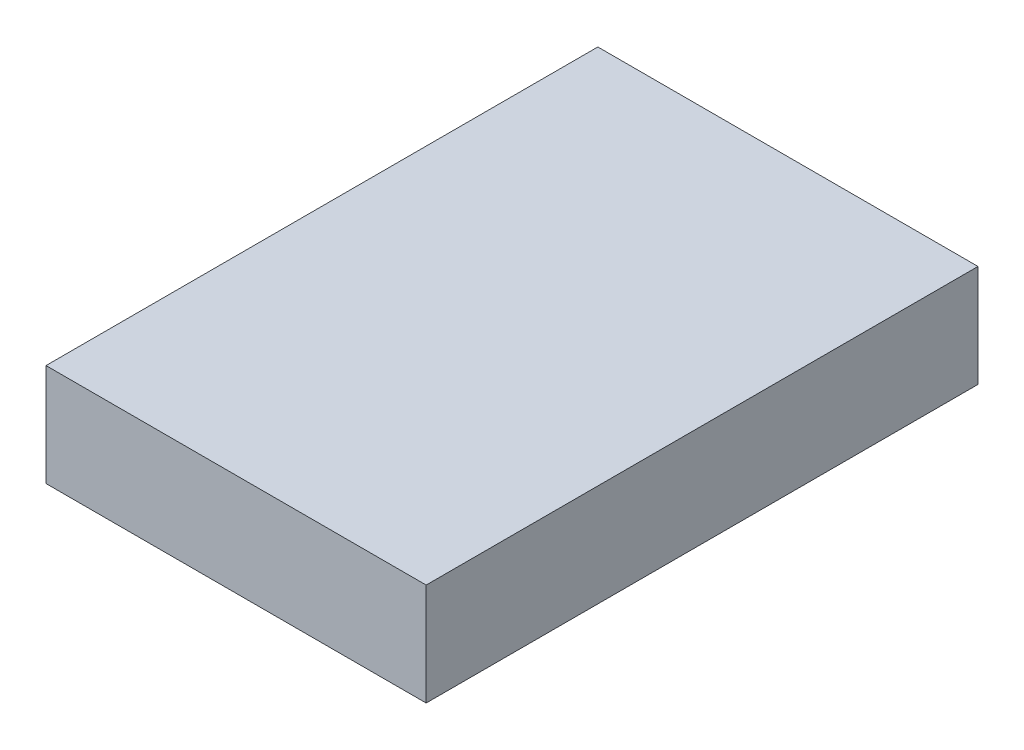
ISO-10303-21;
HEADER;
FILE_DESCRIPTION(('STEP AP214'),'2;1');
FILE_NAME('part.step','',(''),(''),'','','');
FILE_SCHEMA(('AUTOMOTIVE_DESIGN { 1 0 10303 214 1 1 1 1 }'));
ENDSEC;
DATA;
#1=APPLICATION_CONTEXT('core data for automotive mechanical design processes');
#2=APPLICATION_PROTOCOL_DEFINITION('international standard','automotive_design',2000,#1);
#3=PRODUCT_CONTEXT('',#1,'mechanical');
#4=PRODUCT('Part','Part','',(#3));
#5=PRODUCT_RELATED_PRODUCT_CATEGORY('part','',(#4));
#6=PRODUCT_DEFINITION_FORMATION('','',#4);
#7=PRODUCT_DEFINITION_CONTEXT('part definition',#1,'design');
#8=PRODUCT_DEFINITION('design','',#6,#7);
#9=PRODUCT_DEFINITION_SHAPE('','',#8);
#10=(LENGTH_UNIT() NAMED_UNIT(*) SI_UNIT(.MILLI.,.METRE.));
#11=(NAMED_UNIT(*) PLANE_ANGLE_UNIT() SI_UNIT($,.RADIAN.));
#12=(NAMED_UNIT(*) SI_UNIT($,.STERADIAN.) SOLID_ANGLE_UNIT());
#13=UNCERTAINTY_MEASURE_WITH_UNIT(LENGTH_MEASURE(1.E-05),#10,'distance_accuracy_value','');
#14=(GEOMETRIC_REPRESENTATION_CONTEXT(3) GLOBAL_UNCERTAINTY_ASSIGNED_CONTEXT((#13)) GLOBAL_UNIT_ASSIGNED_CONTEXT((#10,
#11,#12)) REPRESENTATION_CONTEXT('',''));
#15=CARTESIAN_POINT('',(0.,0.,0.));
#16=DIRECTION('',(0.,0.,1.));
#17=DIRECTION('',(1.,0.,0.));
#18=AXIS2_PLACEMENT_3D('',#15,#16,#17);
#19=CARTESIAN_POINT('',(0.,2.,0.));
#20=DIRECTION('',(1.,0.,0.));
#21=DIRECTION('',(0.,0.,-1.));
#22=AXIS2_PLACEMENT_3D('',#19,#20,#21);
#23=PLANE('',#22);
#24=DIRECTION('',(0.,0.,1.));
#25=VECTOR('',#24,1.);
#26=CARTESIAN_POINT('',(0.,0.,0.));
#27=LINE('',#26,#25);
#28=CARTESIAN_POINT('',(0.,0.,-10.8));
#29=VERTEX_POINT('',#28);
#30=CARTESIAN_POINT('',(0.,0.,0.));
#31=VERTEX_POINT('',#30);
#32=EDGE_CURVE('E113',#29,#31,#27,.T.);
#33=ORIENTED_EDGE('',*,*,#32,.T.);
#34=DIRECTION('',(0.,-1.,0.));
#35=VECTOR('',#34,1.);
#36=CARTESIAN_POINT('',(0.,2.,0.));
#37=LINE('',#36,#35);
#38=CARTESIAN_POINT('',(0.,2.,0.));
#39=VERTEX_POINT('',#38);
#40=EDGE_CURVE('E11',#39,#31,#37,.T.);
#41=ORIENTED_EDGE('',*,*,#40,.F.);
#42=DIRECTION('',(0.,0.,1.));
#43=VECTOR('',#42,1.);
#44=CARTESIAN_POINT('',(0.,2.,0.));
#45=LINE('',#44,#43);
#46=CARTESIAN_POINT('',(0.,2.,-10.8));
#47=VERTEX_POINT('',#46);
#48=EDGE_CURVE('E97',#47,#39,#45,.T.);
#49=ORIENTED_EDGE('',*,*,#48,.F.);
#50=DIRECTION('',(0.,-1.,0.));
#51=VECTOR('',#50,1.);
#52=CARTESIAN_POINT('',(0.,2.,-10.8));
#53=LINE('',#52,#51);
#54=EDGE_CURVE('E109',#47,#29,#53,.T.);
#55=ORIENTED_EDGE('',*,*,#54,.T.);
#56=EDGE_LOOP('',(#33,#41,#49,#55));
#57=FACE_BOUND('',#56,.T.);
#58=ADVANCED_FACE('F45',(#57),#23,.F.);
#59=CARTESIAN_POINT('',(0.,2.,0.));
#60=DIRECTION('',(0.,0.,-1.));
#61=DIRECTION('',(-1.,0.,0.));
#62=AXIS2_PLACEMENT_3D('',#59,#60,#61);
#63=PLANE('',#62);
#64=DIRECTION('',(1.,0.,0.));
#65=VECTOR('',#64,1.);
#66=CARTESIAN_POINT('',(0.,0.,0.));
#67=LINE('',#66,#65);
#68=CARTESIAN_POINT('',(7.44,0.,0.));
#69=VERTEX_POINT('',#68);
#70=EDGE_CURVE('E102',#31,#69,#67,.T.);
#71=ORIENTED_EDGE('',*,*,#70,.T.);
#72=DIRECTION('',(0.,-1.,0.));
#73=VECTOR('',#72,1.);
#74=CARTESIAN_POINT('',(7.44,2.,0.));
#75=LINE('',#74,#73);
#76=CARTESIAN_POINT('',(7.44,2.,0.));
#77=VERTEX_POINT('',#76);
#78=EDGE_CURVE('E54',#77,#69,#75,.T.);
#79=ORIENTED_EDGE('',*,*,#78,.F.);
#80=DIRECTION('',(1.,0.,0.));
#81=VECTOR('',#80,1.);
#82=CARTESIAN_POINT('',(0.,2.,0.));
#83=LINE('',#82,#81);
#84=EDGE_CURVE('E92',#39,#77,#83,.T.);
#85=ORIENTED_EDGE('',*,*,#84,.F.);
#86=ORIENTED_EDGE('',*,*,#40,.T.);
#87=EDGE_LOOP('',(#71,#79,#85,#86));
#88=FACE_BOUND('',#87,.T.);
#89=ADVANCED_FACE('F101',(#88),#63,.F.);
#90=CARTESIAN_POINT('',(7.44,2.,0.));
#91=DIRECTION('',(-1.,0.,0.));
#92=DIRECTION('',(0.,0.,1.));
#93=AXIS2_PLACEMENT_3D('',#90,#91,#92);
#94=PLANE('',#93);
#95=DIRECTION('',(0.,0.,-1.));
#96=VECTOR('',#95,1.);
#97=CARTESIAN_POINT('',(7.44,0.,0.));
#98=LINE('',#97,#96);
#99=CARTESIAN_POINT('',(7.44,0.,-10.8));
#100=VERTEX_POINT('',#99);
#101=EDGE_CURVE('E79',#69,#100,#98,.T.);
#102=ORIENTED_EDGE('',*,*,#101,.T.);
#103=DIRECTION('',(0.,-1.,0.));
#104=VECTOR('',#103,1.);
#105=CARTESIAN_POINT('',(7.44,2.,-10.8));
#106=LINE('',#105,#104);
#107=CARTESIAN_POINT('',(7.44,2.,-10.8));
#108=VERTEX_POINT('',#107);
#109=EDGE_CURVE('E104',#108,#100,#106,.T.);
#110=ORIENTED_EDGE('',*,*,#109,.F.);
#111=DIRECTION('',(0.,0.,-1.));
#112=VECTOR('',#111,1.);
#113=CARTESIAN_POINT('',(7.44,2.,0.));
#114=LINE('',#113,#112);
#115=EDGE_CURVE('E95',#77,#108,#114,.T.);
#116=ORIENTED_EDGE('',*,*,#115,.F.);
#117=ORIENTED_EDGE('',*,*,#78,.T.);
#118=EDGE_LOOP('',(#102,#110,#116,#117));
#119=FACE_BOUND('',#118,.T.);
#120=ADVANCED_FACE('F105',(#119),#94,.F.);
#121=CARTESIAN_POINT('',(0.,2.,-10.8));
#122=DIRECTION('',(0.,0.,1.));
#123=DIRECTION('',(1.,0.,0.));
#124=AXIS2_PLACEMENT_3D('',#121,#122,#123);
#125=PLANE('',#124);
#126=DIRECTION('',(-1.,0.,0.));
#127=VECTOR('',#126,1.);
#128=CARTESIAN_POINT('',(0.,0.,-10.8));
#129=LINE('',#128,#127);
#130=EDGE_CURVE('E85',#100,#29,#129,.T.);
#131=ORIENTED_EDGE('',*,*,#130,.T.);
#132=ORIENTED_EDGE('',*,*,#54,.F.);
#133=DIRECTION('',(-1.,0.,0.));
#134=VECTOR('',#133,1.);
#135=CARTESIAN_POINT('',(0.,2.,-10.8));
#136=LINE('',#135,#134);
#137=EDGE_CURVE('E62',#108,#47,#136,.T.);
#138=ORIENTED_EDGE('',*,*,#137,.F.);
#139=ORIENTED_EDGE('',*,*,#109,.T.);
#140=EDGE_LOOP('',(#131,#132,#138,#139));
#141=FACE_BOUND('',#140,.T.);
#142=ADVANCED_FACE('F126',(#141),#125,.F.);
#143=CARTESIAN_POINT('',(0.,2.,0.));
#144=DIRECTION('',(0.,-1.,0.));
#145=DIRECTION('',(0.,0.,-1.));
#146=AXIS2_PLACEMENT_3D('',#143,#144,#145);
#147=PLANE('',#146);
#148=ORIENTED_EDGE('',*,*,#48,.T.);
#149=ORIENTED_EDGE('',*,*,#84,.T.);
#150=ORIENTED_EDGE('',*,*,#115,.T.);
#151=ORIENTED_EDGE('',*,*,#137,.T.);
#152=EDGE_LOOP('',(#148,#149,#150,#151));
#153=FACE_BOUND('',#152,.T.);
#154=ADVANCED_FACE('F93',(#153),#147,.F.);
#155=CARTESIAN_POINT('',(0.,0.,0.));
#156=DIRECTION('',(0.,-1.,0.));
#157=DIRECTION('',(0.,0.,-1.));
#158=AXIS2_PLACEMENT_3D('',#155,#156,#157);
#159=PLANE('',#158);
#160=ORIENTED_EDGE('',*,*,#32,.F.);
#161=ORIENTED_EDGE('',*,*,#130,.F.);
#162=ORIENTED_EDGE('',*,*,#101,.F.);
#163=ORIENTED_EDGE('',*,*,#70,.F.);
#164=EDGE_LOOP('',(#160,#161,#162,#163));
#165=FACE_BOUND('',#164,.T.);
#166=ADVANCED_FACE('F129',(#165),#159,.T.);
#167=CLOSED_SHELL('',(#58,#89,#120,#142,#154,#166));
#168=MANIFOLD_SOLID_BREP('B2',#167);
#169=ADVANCED_BREP_SHAPE_REPRESENTATION('',(#18,#168),#14);
#170=SHAPE_DEFINITION_REPRESENTATION(#9,#169);
ENDSEC;
END-ISO-10303-21;
